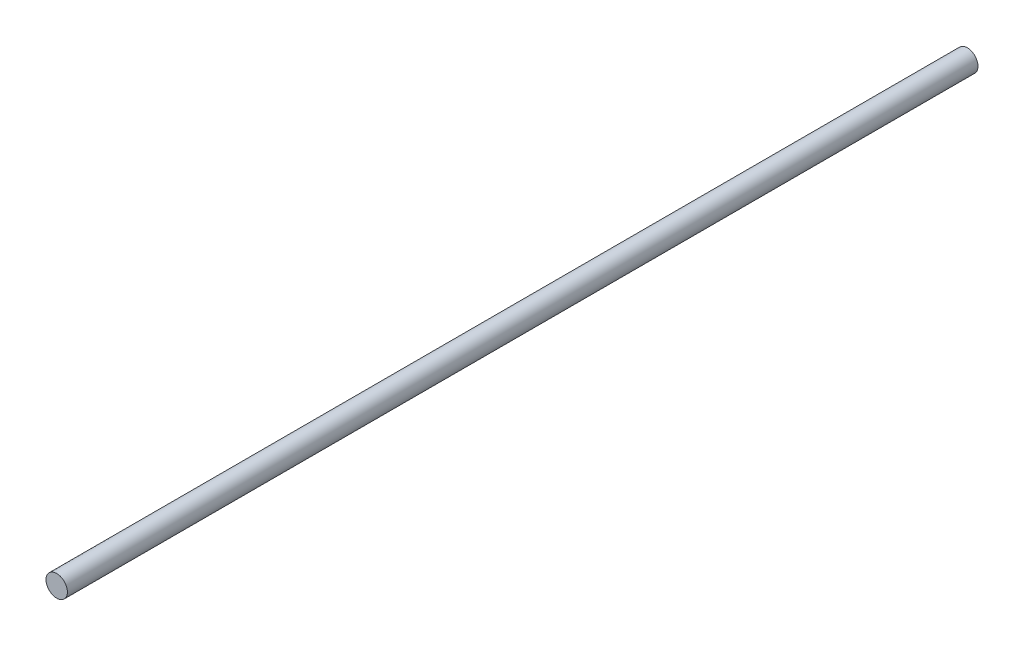
ISO-10303-21;
HEADER;
FILE_DESCRIPTION(('STEP AP214'),'2;1');
FILE_NAME('part.step','',(''),(''),'','','');
FILE_SCHEMA(('AUTOMOTIVE_DESIGN { 1 0 10303 214 1 1 1 1 }'));
ENDSEC;
DATA;
#1=APPLICATION_CONTEXT('core data for automotive mechanical design processes');
#2=APPLICATION_PROTOCOL_DEFINITION('international standard','automotive_design',2000,#1);
#3=PRODUCT_CONTEXT('',#1,'mechanical');
#4=PRODUCT('Part','Part','',(#3));
#5=PRODUCT_RELATED_PRODUCT_CATEGORY('part','',(#4));
#6=PRODUCT_DEFINITION_FORMATION('','',#4);
#7=PRODUCT_DEFINITION_CONTEXT('part definition',#1,'design');
#8=PRODUCT_DEFINITION('design','',#6,#7);
#9=PRODUCT_DEFINITION_SHAPE('','',#8);
#10=(LENGTH_UNIT() NAMED_UNIT(*) SI_UNIT(.MILLI.,.METRE.));
#11=(NAMED_UNIT(*) PLANE_ANGLE_UNIT() SI_UNIT($,.RADIAN.));
#12=(NAMED_UNIT(*) SI_UNIT($,.STERADIAN.) SOLID_ANGLE_UNIT());
#13=UNCERTAINTY_MEASURE_WITH_UNIT(LENGTH_MEASURE(1.E-05),#10,'distance_accuracy_value','');
#14=(GEOMETRIC_REPRESENTATION_CONTEXT(3) GLOBAL_UNCERTAINTY_ASSIGNED_CONTEXT((#13)) GLOBAL_UNIT_ASSIGNED_CONTEXT((#10,
#11,#12)) REPRESENTATION_CONTEXT('',''));
#15=CARTESIAN_POINT('',(0.,0.,0.));
#16=DIRECTION('',(0.,0.,1.));
#17=DIRECTION('',(1.,0.,0.));
#18=AXIS2_PLACEMENT_3D('',#15,#16,#17);
#19=CARTESIAN_POINT('',(0.,0.,340.));
#20=DIRECTION('',(0.,0.,-1.));
#21=DIRECTION('',(-1.,0.,0.));
#22=AXIS2_PLACEMENT_3D('',#19,#20,#21);
#23=CYLINDRICAL_SURFACE('',#22,4.);
#24=CARTESIAN_POINT('',(0.,0.,340.));
#25=DIRECTION('',(0.,0.,1.));
#26=DIRECTION('',(1.,0.,0.));
#27=AXIS2_PLACEMENT_3D('',#24,#25,#26);
#28=CIRCLE('',#27,4.);
#29=CARTESIAN_POINT('',(4.,0.,340.));
#30=VERTEX_POINT('',#29);
#31=EDGE_CURVE('E10',#30,#30,#28,.T.);
#32=ORIENTED_EDGE('',*,*,#31,.F.);
#33=EDGE_LOOP('',(#32));
#34=FACE_BOUND('',#33,.T.);
#35=CARTESIAN_POINT('',(0.,0.,0.));
#36=DIRECTION('',(0.,0.,1.));
#37=DIRECTION('',(1.,0.,0.));
#38=AXIS2_PLACEMENT_3D('',#35,#36,#37);
#39=CIRCLE('',#38,4.);
#40=CARTESIAN_POINT('',(4.,0.,0.));
#41=VERTEX_POINT('',#40);
#42=EDGE_CURVE('E48',#41,#41,#39,.T.);
#43=ORIENTED_EDGE('',*,*,#42,.T.);
#44=EDGE_LOOP('',(#43));
#45=FACE_BOUND('',#44,.T.);
#46=ADVANCED_FACE('F45',(#34,#45),#23,.T.);
#47=CARTESIAN_POINT('',(0.,0.,340.));
#48=DIRECTION('',(0.,0.,1.));
#49=DIRECTION('',(1.,0.,0.));
#50=AXIS2_PLACEMENT_3D('',#47,#48,#49);
#51=PLANE('',#50);
#52=ORIENTED_EDGE('',*,*,#31,.T.);
#53=EDGE_LOOP('',(#52));
#54=FACE_BOUND('',#53,.T.);
#55=ADVANCED_FACE('F62',(#54),#51,.T.);
#56=CARTESIAN_POINT('',(0.,0.,0.));
#57=DIRECTION('',(0.,0.,1.));
#58=DIRECTION('',(1.,0.,0.));
#59=AXIS2_PLACEMENT_3D('',#56,#57,#58);
#60=PLANE('',#59);
#61=ORIENTED_EDGE('',*,*,#42,.F.);
#62=EDGE_LOOP('',(#61));
#63=FACE_BOUND('',#62,.T.);
#64=ADVANCED_FACE('F60',(#63),#60,.F.);
#65=CLOSED_SHELL('',(#46,#55,#64));
#66=MANIFOLD_SOLID_BREP('B2',#65);
#67=ADVANCED_BREP_SHAPE_REPRESENTATION('',(#18,#66),#14);
#68=SHAPE_DEFINITION_REPRESENTATION(#9,#67);
ENDSEC;
END-ISO-10303-21;
